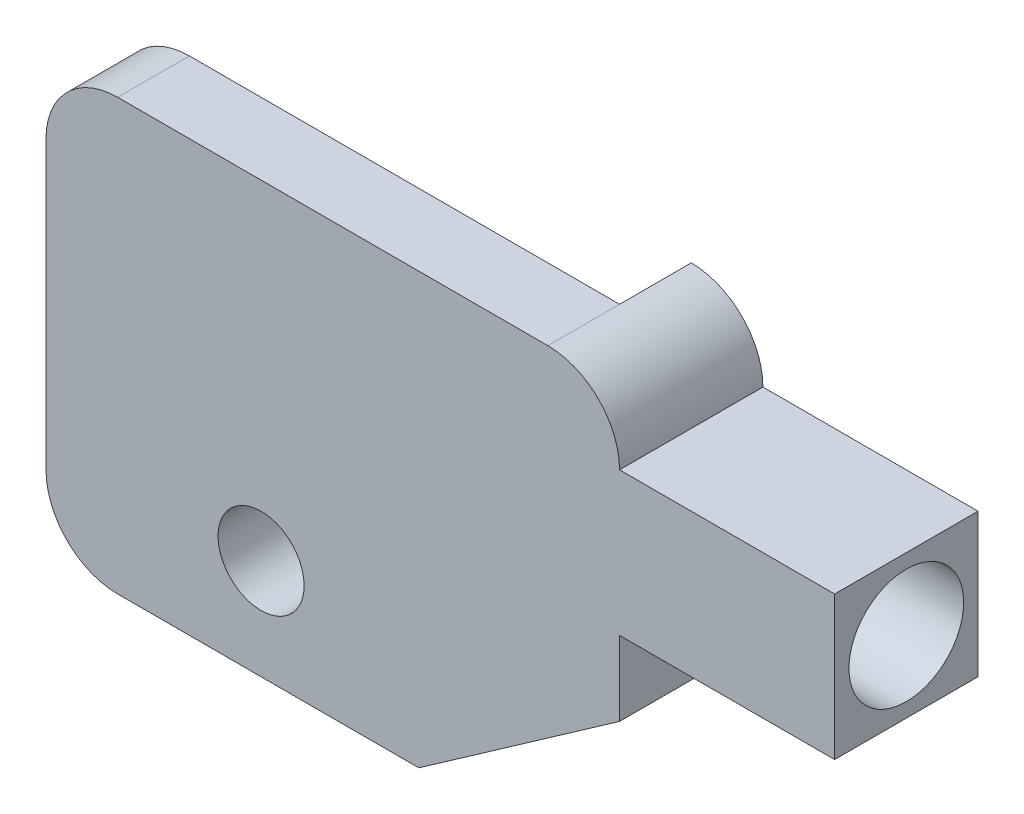
ISO-10303-21;
HEADER;
FILE_DESCRIPTION(('STEP AP214'),'2;1');
FILE_NAME('part.step','',(''),(''),'','','');
FILE_SCHEMA(('AUTOMOTIVE_DESIGN { 1 0 10303 214 1 1 1 1 }'));
ENDSEC;
DATA;
#1=APPLICATION_CONTEXT('core data for automotive mechanical design processes');
#2=APPLICATION_PROTOCOL_DEFINITION('international standard','automotive_design',2000,#1);
#3=PRODUCT_CONTEXT('',#1,'mechanical');
#4=PRODUCT('Part','Part','',(#3));
#5=PRODUCT_RELATED_PRODUCT_CATEGORY('part','',(#4));
#6=PRODUCT_DEFINITION_FORMATION('','',#4);
#7=PRODUCT_DEFINITION_CONTEXT('part definition',#1,'design');
#8=PRODUCT_DEFINITION('design','',#6,#7);
#9=PRODUCT_DEFINITION_SHAPE('','',#8);
#10=(LENGTH_UNIT() NAMED_UNIT(*) SI_UNIT(.MILLI.,.METRE.));
#11=(NAMED_UNIT(*) PLANE_ANGLE_UNIT() SI_UNIT($,.RADIAN.));
#12=(NAMED_UNIT(*) SI_UNIT($,.STERADIAN.) SOLID_ANGLE_UNIT());
#13=UNCERTAINTY_MEASURE_WITH_UNIT(LENGTH_MEASURE(1.E-05),#10,'distance_accuracy_value','');
#14=(GEOMETRIC_REPRESENTATION_CONTEXT(3) GLOBAL_UNCERTAINTY_ASSIGNED_CONTEXT((#13)) GLOBAL_UNIT_ASSIGNED_CONTEXT((#10,
#11,#12)) REPRESENTATION_CONTEXT('',''));
#15=CARTESIAN_POINT('',(0.,0.,0.));
#16=DIRECTION('',(0.,0.,1.));
#17=DIRECTION('',(1.,0.,0.));
#18=AXIS2_PLACEMENT_3D('',#15,#16,#17);
#19=CARTESIAN_POINT('',(19.05,6.34999999999999,6.35));
#20=DIRECTION('',(1.,0.,0.));
#21=DIRECTION('',(0.,0.,-1.));
#22=AXIS2_PLACEMENT_3D('',#19,#20,#21);
#23=PLANE('',#22);
#24=CARTESIAN_POINT('',(19.05,6.34999999999999,6.35));
#25=DIRECTION('',(1.,0.,0.));
#26=DIRECTION('',(0.,0.,-1.));
#27=AXIS2_PLACEMENT_3D('',#24,#25,#26);
#28=CIRCLE('',#27,5.08);
#29=CARTESIAN_POINT('',(19.05,11.43,6.35));
#30=VERTEX_POINT('',#29);
#31=CARTESIAN_POINT('',(19.05,1.26999999999998,6.35));
#32=VERTEX_POINT('',#31);
#33=EDGE_CURVE('E244',#30,#32,#28,.T.);
#34=ORIENTED_EDGE('',*,*,#33,.T.);
#35=DIRECTION('',(0.,1.,0.));
#36=VECTOR('',#35,1.);
#37=CARTESIAN_POINT('',(19.05,-19.05,6.35));
#38=LINE('',#37,#36);
#39=EDGE_CURVE('E200',#32,#30,#38,.T.);
#40=ORIENTED_EDGE('',*,*,#39,.T.);
#41=EDGE_LOOP('',(#34,#40));
#42=FACE_BOUND('',#41,.T.);
#43=ADVANCED_FACE('F35',(#42),#23,.T.);
#44=CARTESIAN_POINT('',(25.4,-19.05,12.7));
#45=DIRECTION('',(-1.,0.,0.));
#46=DIRECTION('',(0.,0.,1.));
#47=AXIS2_PLACEMENT_3D('',#44,#45,#46);
#48=PLANE('',#47);
#49=DIRECTION('',(0.,1.,0.));
#50=VECTOR('',#49,1.);
#51=CARTESIAN_POINT('',(25.4,-19.05,12.7));
#52=LINE('',#51,#50);
#53=CARTESIAN_POINT('',(25.4,-6.60030997063135,12.7));
#54=VERTEX_POINT('',#53);
#55=CARTESIAN_POINT('',(25.4,0.,12.7));
#56=VERTEX_POINT('',#55);
#57=EDGE_CURVE('E209',#54,#56,#52,.T.);
#58=ORIENTED_EDGE('',*,*,#57,.F.);
#59=DIRECTION('',(0.,0.,-1.));
#60=VECTOR('',#59,1.);
#61=CARTESIAN_POINT('',(25.4,-6.60030997063135,12.7));
#62=LINE('',#61,#60);
#63=CARTESIAN_POINT('',(25.4,-6.60030997063135,0.));
#64=VERTEX_POINT('',#63);
#65=EDGE_CURVE('E184',#54,#64,#62,.T.);
#66=ORIENTED_EDGE('',*,*,#65,.T.);
#67=DIRECTION('',(0.,1.,0.));
#68=VECTOR('',#67,1.);
#69=CARTESIAN_POINT('',(25.4,-19.05,0.));
#70=LINE('',#69,#68);
#71=CARTESIAN_POINT('',(25.4,0.,0.));
#72=VERTEX_POINT('',#71);
#73=EDGE_CURVE('E223',#64,#72,#70,.T.);
#74=ORIENTED_EDGE('',*,*,#73,.T.);
#75=DIRECTION('',(0.,0.,-1.));
#76=VECTOR('',#75,1.);
#77=CARTESIAN_POINT('',(25.4,0.,12.7));
#78=LINE('',#77,#76);
#79=EDGE_CURVE('E215',#56,#72,#78,.T.);
#80=ORIENTED_EDGE('',*,*,#79,.F.);
#81=EDGE_LOOP('',(#58,#66,#74,#80));
#82=FACE_BOUND('',#81,.T.);
#83=ADVANCED_FACE('F213',(#82),#48,.F.);
#84=CARTESIAN_POINT('',(-25.4,-19.05,12.7));
#85=DIRECTION('',(1.,0.,0.));
#86=DIRECTION('',(0.,0.,-1.));
#87=AXIS2_PLACEMENT_3D('',#84,#85,#86);
#88=PLANE('',#87);
#89=DIRECTION('',(0.,0.,-1.));
#90=VECTOR('',#89,1.);
#91=CARTESIAN_POINT('',(-25.4,12.7,12.7));
#92=LINE('',#91,#90);
#93=CARTESIAN_POINT('',(-25.4,12.7,12.7));
#94=VERTEX_POINT('',#93);
#95=CARTESIAN_POINT('',(-25.4,12.7,6.35));
#96=VERTEX_POINT('',#95);
#97=EDGE_CURVE('E161',#94,#96,#92,.T.);
#98=ORIENTED_EDGE('',*,*,#97,.T.);
#99=DIRECTION('',(0.,1.,0.));
#100=VECTOR('',#99,1.);
#101=CARTESIAN_POINT('',(-25.4,-19.05,6.35));
#102=LINE('',#101,#100);
#103=CARTESIAN_POINT('',(-25.4,-12.7,6.35));
#104=VERTEX_POINT('',#103);
#105=EDGE_CURVE('E155',#104,#96,#102,.T.);
#106=ORIENTED_EDGE('',*,*,#105,.F.);
#107=DIRECTION('',(0.,0.,-1.));
#108=VECTOR('',#107,1.);
#109=CARTESIAN_POINT('',(-25.4,-12.7,12.7));
#110=LINE('',#109,#108);
#111=CARTESIAN_POINT('',(-25.4,-12.7,12.7));
#112=VERTEX_POINT('',#111);
#113=EDGE_CURVE('E165',#104,#112,#110,.F.);
#114=ORIENTED_EDGE('',*,*,#113,.T.);
#115=DIRECTION('',(0.,-1.,0.));
#116=VECTOR('',#115,1.);
#117=CARTESIAN_POINT('',(-25.4,-19.05,12.7));
#118=LINE('',#117,#116);
#119=EDGE_CURVE('E220',#94,#112,#118,.T.);
#120=ORIENTED_EDGE('',*,*,#119,.F.);
#121=EDGE_LOOP('',(#98,#106,#114,#120));
#122=FACE_BOUND('',#121,.T.);
#123=ADVANCED_FACE('F275',(#122),#88,.F.);
#124=CARTESIAN_POINT('',(25.4,-19.05,12.7));
#125=DIRECTION('',(0.,1.,0.));
#126=DIRECTION('',(-1.,0.,0.));
#127=AXIS2_PLACEMENT_3D('',#124,#125,#126);
#128=PLANE('',#127);
#129=DIRECTION('',(-1.,0.,0.));
#130=VECTOR('',#129,1.);
#131=CARTESIAN_POINT('',(19.05,-19.05,6.35));
#132=LINE('',#131,#130);
#133=CARTESIAN_POINT('',(7.61999999999991,-19.05,6.35));
#134=VERTEX_POINT('',#133);
#135=CARTESIAN_POINT('',(-19.05,-19.05,6.35));
#136=VERTEX_POINT('',#135);
#137=EDGE_CURVE('E145',#134,#136,#132,.T.);
#138=ORIENTED_EDGE('',*,*,#137,.F.);
#139=DIRECTION('',(0.,0.,1.));
#140=VECTOR('',#139,1.);
#141=CARTESIAN_POINT('',(7.61999999999991,-19.05,12.7));
#142=LINE('',#141,#140);
#143=CARTESIAN_POINT('',(7.6199999999999,-19.05,12.7));
#144=VERTEX_POINT('',#143);
#145=EDGE_CURVE('E43',#134,#144,#142,.T.);
#146=ORIENTED_EDGE('',*,*,#145,.T.);
#147=DIRECTION('',(1.,0.,0.));
#148=VECTOR('',#147,1.);
#149=CARTESIAN_POINT('',(25.4,-19.05,12.7));
#150=LINE('',#149,#148);
#151=CARTESIAN_POINT('',(-19.05,-19.05,12.7));
#152=VERTEX_POINT('',#151);
#153=EDGE_CURVE('E211',#152,#144,#150,.T.);
#154=ORIENTED_EDGE('',*,*,#153,.F.);
#155=DIRECTION('',(0.,0.,-1.));
#156=VECTOR('',#155,1.);
#157=CARTESIAN_POINT('',(-19.05,-19.05,12.7));
#158=LINE('',#157,#156);
#159=EDGE_CURVE('E162',#152,#136,#158,.T.);
#160=ORIENTED_EDGE('',*,*,#159,.T.);
#161=EDGE_LOOP('',(#138,#146,#154,#160));
#162=FACE_BOUND('',#161,.T.);
#163=ADVANCED_FACE('F280',(#162),#128,.F.);
#164=CARTESIAN_POINT('',(25.4,19.05,12.7));
#165=DIRECTION('',(0.,-1.,0.));
#166=DIRECTION('',(1.,0.,0.));
#167=AXIS2_PLACEMENT_3D('',#164,#165,#166);
#168=PLANE('',#167);
#169=DIRECTION('',(0.,0.,-1.));
#170=VECTOR('',#169,1.);
#171=CARTESIAN_POINT('',(19.05,19.05,12.7));
#172=LINE('',#171,#170);
#173=CARTESIAN_POINT('',(19.05,19.05,12.7));
#174=VERTEX_POINT('',#173);
#175=CARTESIAN_POINT('',(19.05,19.05,6.35));
#176=VERTEX_POINT('',#175);
#177=EDGE_CURVE('E179',#174,#176,#172,.T.);
#178=ORIENTED_EDGE('',*,*,#177,.T.);
#179=DIRECTION('',(-1.,0.,0.));
#180=VECTOR('',#179,1.);
#181=CARTESIAN_POINT('',(19.05,19.05,6.35));
#182=LINE('',#181,#180);
#183=CARTESIAN_POINT('',(-19.05,19.05,6.35));
#184=VERTEX_POINT('',#183);
#185=EDGE_CURVE('E189',#176,#184,#182,.T.);
#186=ORIENTED_EDGE('',*,*,#185,.T.);
#187=DIRECTION('',(0.,0.,-1.));
#188=VECTOR('',#187,1.);
#189=CARTESIAN_POINT('',(-19.05,19.05,12.7));
#190=LINE('',#189,#188);
#191=CARTESIAN_POINT('',(-19.05,19.05,12.7));
#192=VERTEX_POINT('',#191);
#193=EDGE_CURVE('E181',#184,#192,#190,.F.);
#194=ORIENTED_EDGE('',*,*,#193,.T.);
#195=DIRECTION('',(-1.,0.,0.));
#196=VECTOR('',#195,1.);
#197=CARTESIAN_POINT('',(25.4,19.05,12.7));
#198=LINE('',#197,#196);
#199=EDGE_CURVE('E168',#174,#192,#198,.T.);
#200=ORIENTED_EDGE('',*,*,#199,.F.);
#201=EDGE_LOOP('',(#178,#186,#194,#200));
#202=FACE_BOUND('',#201,.T.);
#203=ADVANCED_FACE('F282',(#202),#168,.F.);
#204=CARTESIAN_POINT('',(0.,0.,12.7));
#205=DIRECTION('',(0.,0.,1.));
#206=DIRECTION('',(1.,0.,0.));
#207=AXIS2_PLACEMENT_3D('',#204,#205,#206);
#208=PLANE('',#207);
#209=CARTESIAN_POINT('',(-6.35,-10.16,12.7));
#210=DIRECTION('',(0.,0.,1.));
#211=DIRECTION('',(1.,0.,0.));
#212=AXIS2_PLACEMENT_3D('',#209,#210,#211);
#213=CIRCLE('',#212,3.81);
#214=CARTESIAN_POINT('',(-2.54,-10.16,12.7));
#215=VERTEX_POINT('',#214);
#216=EDGE_CURVE('E224',#215,#215,#213,.T.);
#217=ORIENTED_EDGE('',*,*,#216,.F.);
#218=EDGE_LOOP('',(#217));
#219=FACE_BOUND('',#218,.T.);
#220=ORIENTED_EDGE('',*,*,#153,.T.);
#221=DIRECTION('',(-0.819152044288993,-0.573576436351045,0.));
#222=VECTOR('',#221,1.);
#223=CARTESIAN_POINT('',(11.4574754669149,-16.3629707503713,12.7));
#224=LINE('',#223,#222);
#225=EDGE_CURVE('E11',#144,#54,#224,.F.);
#226=ORIENTED_EDGE('',*,*,#225,.T.);
#227=ORIENTED_EDGE('',*,*,#57,.T.);
#228=DIRECTION('',(-1.,0.,0.));
#229=VECTOR('',#228,1.);
#230=CARTESIAN_POINT('',(44.45,0.,12.7));
#231=LINE('',#230,#229);
#232=CARTESIAN_POINT('',(44.45,0.,12.7));
#233=VERTEX_POINT('',#232);
#234=EDGE_CURVE('E227',#233,#56,#231,.T.);
#235=ORIENTED_EDGE('',*,*,#234,.F.);
#236=DIRECTION('',(0.,-1.,0.));
#237=VECTOR('',#236,1.);
#238=CARTESIAN_POINT('',(44.45,0.,12.7));
#239=LINE('',#238,#237);
#240=CARTESIAN_POINT('',(44.45,12.7,12.7));
#241=VERTEX_POINT('',#240);
#242=EDGE_CURVE('E243',#241,#233,#239,.T.);
#243=ORIENTED_EDGE('',*,*,#242,.F.);
#244=DIRECTION('',(-1.,0.,0.));
#245=VECTOR('',#244,1.);
#246=CARTESIAN_POINT('',(44.45,12.7,12.7));
#247=LINE('',#246,#245);
#248=CARTESIAN_POINT('',(25.4,12.7,12.7));
#249=VERTEX_POINT('',#248);
#250=EDGE_CURVE('E238',#241,#249,#247,.T.);
#251=ORIENTED_EDGE('',*,*,#250,.T.);
#252=CARTESIAN_POINT('',(19.05,12.7,12.7));
#253=DIRECTION('',(0.,0.,1.));
#254=DIRECTION('',(1.,0.,0.));
#255=AXIS2_PLACEMENT_3D('',#252,#253,#254);
#256=CIRCLE('',#255,6.35);
#257=EDGE_CURVE('E173',#249,#174,#256,.T.);
#258=ORIENTED_EDGE('',*,*,#257,.T.);
#259=ORIENTED_EDGE('',*,*,#199,.T.);
#260=CARTESIAN_POINT('',(-19.05,12.7,12.7));
#261=DIRECTION('',(0.,0.,1.));
#262=DIRECTION('',(1.,0.,0.));
#263=AXIS2_PLACEMENT_3D('',#260,#261,#262);
#264=CIRCLE('',#263,6.35);
#265=EDGE_CURVE('E175',#192,#94,#264,.T.);
#266=ORIENTED_EDGE('',*,*,#265,.T.);
#267=ORIENTED_EDGE('',*,*,#119,.T.);
#268=CARTESIAN_POINT('',(-19.05,-12.7,12.7));
#269=DIRECTION('',(0.,0.,1.));
#270=DIRECTION('',(1.,0.,0.));
#271=AXIS2_PLACEMENT_3D('',#268,#269,#270);
#272=CIRCLE('',#271,6.35);
#273=EDGE_CURVE('E177',#112,#152,#272,.T.);
#274=ORIENTED_EDGE('',*,*,#273,.T.);
#275=EDGE_LOOP('',(#220,#226,#227,#235,#243,#251,#258,#259,#266,#267,#274));
#276=FACE_BOUND('',#275,.T.);
#277=ADVANCED_FACE('F207',(#219,#276),#208,.T.);
#278=CARTESIAN_POINT('',(0.,0.,0.));
#279=DIRECTION('',(0.,0.,1.));
#280=DIRECTION('',(1.,0.,0.));
#281=AXIS2_PLACEMENT_3D('',#278,#279,#280);
#282=PLANE('',#281);
#283=ORIENTED_EDGE('',*,*,#73,.F.);
#284=DIRECTION('',(0.819152044288993,0.573576436351045,0.));
#285=VECTOR('',#284,1.);
#286=CARTESIAN_POINT('',(25.4,-6.60030997063135,0.));
#287=LINE('',#286,#285);
#288=CARTESIAN_POINT('',(19.05,-11.046627838263,0.));
#289=VERTEX_POINT('',#288);
#290=EDGE_CURVE('E154',#64,#289,#287,.F.);
#291=ORIENTED_EDGE('',*,*,#290,.T.);
#292=DIRECTION('',(0.,-1.,0.));
#293=VECTOR('',#292,1.);
#294=CARTESIAN_POINT('',(19.05,-19.05,0.));
#295=LINE('',#294,#293);
#296=CARTESIAN_POINT('',(19.05,19.05,0.));
#297=VERTEX_POINT('',#296);
#298=EDGE_CURVE('E137',#297,#289,#295,.T.);
#299=ORIENTED_EDGE('',*,*,#298,.F.);
#300=CARTESIAN_POINT('',(19.05,12.7,0.));
#301=DIRECTION('',(0.,0.,1.));
#302=DIRECTION('',(1.,0.,0.));
#303=AXIS2_PLACEMENT_3D('',#300,#301,#302);
#304=CIRCLE('',#303,6.35);
#305=CARTESIAN_POINT('',(25.4,12.7,0.));
#306=VERTEX_POINT('',#305);
#307=EDGE_CURVE('E152',#297,#306,#304,.F.);
#308=ORIENTED_EDGE('',*,*,#307,.T.);
#309=DIRECTION('',(-1.,0.,0.));
#310=VECTOR('',#309,1.);
#311=CARTESIAN_POINT('',(44.45,12.7,0.));
#312=LINE('',#311,#310);
#313=CARTESIAN_POINT('',(44.45,12.7,0.));
#314=VERTEX_POINT('',#313);
#315=EDGE_CURVE('E236',#314,#306,#312,.T.);
#316=ORIENTED_EDGE('',*,*,#315,.F.);
#317=DIRECTION('',(0.,1.,0.));
#318=VECTOR('',#317,1.);
#319=CARTESIAN_POINT('',(44.45,0.,0.));
#320=LINE('',#319,#318);
#321=CARTESIAN_POINT('',(44.45,0.,0.));
#322=VERTEX_POINT('',#321);
#323=EDGE_CURVE('E246',#322,#314,#320,.T.);
#324=ORIENTED_EDGE('',*,*,#323,.F.);
#325=DIRECTION('',(-1.,0.,0.));
#326=VECTOR('',#325,1.);
#327=CARTESIAN_POINT('',(44.45,0.,0.));
#328=LINE('',#327,#326);
#329=EDGE_CURVE('E231',#322,#72,#328,.T.);
#330=ORIENTED_EDGE('',*,*,#329,.T.);
#331=EDGE_LOOP('',(#283,#291,#299,#308,#316,#324,#330));
#332=FACE_BOUND('',#331,.T.);
#333=ADVANCED_FACE('F150',(#332),#282,.F.);
#334=CARTESIAN_POINT('',(-19.05,-12.7,12.7));
#335=DIRECTION('',(0.,0.,-1.));
#336=DIRECTION('',(-1.,0.,0.));
#337=AXIS2_PLACEMENT_3D('',#334,#335,#336);
#338=CYLINDRICAL_SURFACE('',#337,6.35);
#339=CARTESIAN_POINT('',(-19.05,-12.7,6.35));
#340=DIRECTION('',(0.,0.,1.));
#341=DIRECTION('',(1.,0.,0.));
#342=AXIS2_PLACEMENT_3D('',#339,#340,#341);
#343=CIRCLE('',#342,6.35);
#344=EDGE_CURVE('E258',#136,#104,#343,.F.);
#345=ORIENTED_EDGE('',*,*,#344,.F.);
#346=ORIENTED_EDGE('',*,*,#159,.F.);
#347=ORIENTED_EDGE('',*,*,#273,.F.);
#348=ORIENTED_EDGE('',*,*,#113,.F.);
#349=EDGE_LOOP('',(#345,#346,#347,#348));
#350=FACE_BOUND('',#349,.T.);
#351=ADVANCED_FACE('F279',(#350),#338,.T.);
#352=CARTESIAN_POINT('',(-19.05,12.7,12.7));
#353=DIRECTION('',(0.,0.,-1.));
#354=DIRECTION('',(-1.,0.,0.));
#355=AXIS2_PLACEMENT_3D('',#352,#353,#354);
#356=CYLINDRICAL_SURFACE('',#355,6.35);
#357=CARTESIAN_POINT('',(-19.05,12.7,6.35));
#358=DIRECTION('',(0.,0.,1.));
#359=DIRECTION('',(1.,0.,0.));
#360=AXIS2_PLACEMENT_3D('',#357,#358,#359);
#361=CIRCLE('',#360,6.35);
#362=EDGE_CURVE('E188',#96,#184,#361,.F.);
#363=ORIENTED_EDGE('',*,*,#362,.F.);
#364=ORIENTED_EDGE('',*,*,#97,.F.);
#365=ORIENTED_EDGE('',*,*,#265,.F.);
#366=ORIENTED_EDGE('',*,*,#193,.F.);
#367=EDGE_LOOP('',(#363,#364,#365,#366));
#368=FACE_BOUND('',#367,.T.);
#369=ADVANCED_FACE('F272',(#368),#356,.T.);
#370=CARTESIAN_POINT('',(19.05,12.7,12.7));
#371=DIRECTION('',(0.,0.,-1.));
#372=DIRECTION('',(-1.,0.,0.));
#373=AXIS2_PLACEMENT_3D('',#370,#371,#372);
#374=CYLINDRICAL_SURFACE('',#373,6.35);
#375=ORIENTED_EDGE('',*,*,#257,.F.);
#376=DIRECTION('',(0.,0.,-1.));
#377=VECTOR('',#376,1.);
#378=CARTESIAN_POINT('',(25.4,12.7,12.7));
#379=LINE('',#378,#377);
#380=EDGE_CURVE('E159',#306,#249,#379,.F.);
#381=ORIENTED_EDGE('',*,*,#380,.F.);
#382=ORIENTED_EDGE('',*,*,#307,.F.);
#383=DIRECTION('',(0.,0.,-1.));
#384=VECTOR('',#383,1.);
#385=CARTESIAN_POINT('',(19.05,19.05,0.));
#386=LINE('',#385,#384);
#387=EDGE_CURVE('E134',#176,#297,#386,.T.);
#388=ORIENTED_EDGE('',*,*,#387,.F.);
#389=ORIENTED_EDGE('',*,*,#177,.F.);
#390=EDGE_LOOP('',(#375,#381,#382,#388,#389));
#391=FACE_BOUND('',#390,.T.);
#392=ADVANCED_FACE('F157',(#391),#374,.T.);
#393=CARTESIAN_POINT('',(-6.35,-10.16,0.));
#394=DIRECTION('',(0.,0.,1.));
#395=DIRECTION('',(1.,0.,0.));
#396=AXIS2_PLACEMENT_3D('',#393,#394,#395);
#397=CYLINDRICAL_SURFACE('',#396,3.81);
#398=CARTESIAN_POINT('',(-6.35,-10.16,6.35));
#399=DIRECTION('',(0.,0.,1.));
#400=DIRECTION('',(1.,0.,0.));
#401=AXIS2_PLACEMENT_3D('',#398,#399,#400);
#402=CIRCLE('',#401,3.81);
#403=CARTESIAN_POINT('',(-2.54,-10.16,6.35));
#404=VERTEX_POINT('',#403);
#405=EDGE_CURVE('E185',#404,#404,#402,.F.);
#406=ORIENTED_EDGE('',*,*,#405,.T.);
#407=EDGE_LOOP('',(#406));
#408=FACE_BOUND('',#407,.T.);
#409=ORIENTED_EDGE('',*,*,#216,.T.);
#410=EDGE_LOOP('',(#409));
#411=FACE_BOUND('',#410,.T.);
#412=ADVANCED_FACE('F316',(#408,#411),#397,.F.);
#413=CARTESIAN_POINT('',(44.45,0.,12.7));
#414=DIRECTION('',(0.,1.,0.));
#415=DIRECTION('',(0.,0.,1.));
#416=AXIS2_PLACEMENT_3D('',#413,#414,#415);
#417=PLANE('',#416);
#418=ORIENTED_EDGE('',*,*,#79,.T.);
#419=ORIENTED_EDGE('',*,*,#329,.F.);
#420=DIRECTION('',(0.,0.,-1.));
#421=VECTOR('',#420,1.);
#422=CARTESIAN_POINT('',(44.45,0.,12.7));
#423=LINE('',#422,#421);
#424=EDGE_CURVE('E248',#233,#322,#423,.T.);
#425=ORIENTED_EDGE('',*,*,#424,.F.);
#426=ORIENTED_EDGE('',*,*,#234,.T.);
#427=EDGE_LOOP('',(#418,#419,#425,#426));
#428=FACE_BOUND('',#427,.T.);
#429=ADVANCED_FACE('F312',(#428),#417,.F.);
#430=CARTESIAN_POINT('',(44.45,12.7,12.7));
#431=DIRECTION('',(0.,-1.,0.));
#432=DIRECTION('',(0.,0.,-1.));
#433=AXIS2_PLACEMENT_3D('',#430,#431,#432);
#434=PLANE('',#433);
#435=ORIENTED_EDGE('',*,*,#380,.T.);
#436=ORIENTED_EDGE('',*,*,#250,.F.);
#437=DIRECTION('',(0.,0.,1.));
#438=VECTOR('',#437,1.);
#439=CARTESIAN_POINT('',(44.45,12.7,12.7));
#440=LINE('',#439,#438);
#441=EDGE_CURVE('E241',#314,#241,#440,.T.);
#442=ORIENTED_EDGE('',*,*,#441,.F.);
#443=ORIENTED_EDGE('',*,*,#315,.T.);
#444=EDGE_LOOP('',(#435,#436,#442,#443));
#445=FACE_BOUND('',#444,.T.);
#446=ADVANCED_FACE('F308',(#445),#434,.F.);
#447=CARTESIAN_POINT('',(44.45,0.,0.));
#448=DIRECTION('',(-1.,0.,0.));
#449=DIRECTION('',(0.,0.,1.));
#450=AXIS2_PLACEMENT_3D('',#447,#448,#449);
#451=PLANE('',#450);
#452=CARTESIAN_POINT('',(44.45,6.34999999999999,6.35));
#453=DIRECTION('',(1.,0.,0.));
#454=DIRECTION('',(0.,0.,-1.));
#455=AXIS2_PLACEMENT_3D('',#452,#453,#454);
#456=CIRCLE('',#455,5.08);
#457=CARTESIAN_POINT('',(44.45,6.34999999999999,1.27));
#458=VERTEX_POINT('',#457);
#459=EDGE_CURVE('E252',#458,#458,#456,.T.);
#460=ORIENTED_EDGE('',*,*,#459,.F.);
#461=EDGE_LOOP('',(#460));
#462=FACE_BOUND('',#461,.T.);
#463=ORIENTED_EDGE('',*,*,#242,.T.);
#464=ORIENTED_EDGE('',*,*,#424,.T.);
#465=ORIENTED_EDGE('',*,*,#323,.T.);
#466=ORIENTED_EDGE('',*,*,#441,.T.);
#467=EDGE_LOOP('',(#463,#464,#465,#466));
#468=FACE_BOUND('',#467,.T.);
#469=ADVANCED_FACE('F304',(#462,#468),#451,.F.);
#470=CARTESIAN_POINT('',(19.05,6.34999999999999,6.35));
#471=DIRECTION('',(1.,0.,0.));
#472=DIRECTION('',(0.,0.,-1.));
#473=AXIS2_PLACEMENT_3D('',#470,#471,#472);
#474=CYLINDRICAL_SURFACE('',#473,5.08);
#475=ORIENTED_EDGE('',*,*,#33,.F.);
#476=EDGE_CURVE('E255',#32,#30,#28,.T.);
#477=ORIENTED_EDGE('',*,*,#476,.F.);
#478=EDGE_LOOP('',(#475,#477));
#479=FACE_BOUND('',#478,.T.);
#480=ORIENTED_EDGE('',*,*,#459,.T.);
#481=EDGE_LOOP('',(#480));
#482=FACE_BOUND('',#481,.T.);
#483=ADVANCED_FACE('F301',(#479,#482),#474,.F.);
#484=CARTESIAN_POINT('',(19.05,-19.05,6.35));
#485=DIRECTION('',(0.,0.,1.));
#486=DIRECTION('',(1.,0.,0.));
#487=AXIS2_PLACEMENT_3D('',#484,#485,#486);
#488=PLANE('',#487);
#489=CARTESIAN_POINT('',(19.05,-11.046627838263,6.35));
#490=VERTEX_POINT('',#489);
#491=EDGE_CURVE('E146',#490,#32,#38,.T.);
#492=ORIENTED_EDGE('',*,*,#491,.F.);
#493=DIRECTION('',(0.819152044288993,0.573576436351045,0.));
#494=VECTOR('',#493,1.);
#495=CARTESIAN_POINT('',(25.4,-6.60030997063135,6.35));
#496=LINE('',#495,#494);
#497=EDGE_CURVE('E57',#490,#134,#496,.F.);
#498=ORIENTED_EDGE('',*,*,#497,.T.);
#499=ORIENTED_EDGE('',*,*,#137,.T.);
#500=ORIENTED_EDGE('',*,*,#344,.T.);
#501=ORIENTED_EDGE('',*,*,#105,.T.);
#502=ORIENTED_EDGE('',*,*,#362,.T.);
#503=ORIENTED_EDGE('',*,*,#185,.F.);
#504=EDGE_CURVE('E140',#30,#176,#38,.T.);
#505=ORIENTED_EDGE('',*,*,#504,.F.);
#506=ORIENTED_EDGE('',*,*,#39,.F.);
#507=EDGE_LOOP('',(#492,#498,#499,#500,#501,#502,#503,#505,#506));
#508=FACE_BOUND('',#507,.T.);
#509=ORIENTED_EDGE('',*,*,#405,.F.);
#510=EDGE_LOOP('',(#509));
#511=FACE_BOUND('',#510,.T.);
#512=ADVANCED_FACE('F197',(#508,#511),#488,.F.);
#513=CARTESIAN_POINT('',(19.05,0.,0.));
#514=DIRECTION('',(1.,0.,0.));
#515=DIRECTION('',(0.,0.,-1.));
#516=AXIS2_PLACEMENT_3D('',#513,#514,#515);
#517=PLANE('',#516);
#518=ORIENTED_EDGE('',*,*,#298,.T.);
#519=DIRECTION('',(0.,0.,-1.));
#520=VECTOR('',#519,1.);
#521=CARTESIAN_POINT('',(19.05,-11.046627838263,12.7));
#522=LINE('',#521,#520);
#523=EDGE_CURVE('E193',#289,#490,#522,.F.);
#524=ORIENTED_EDGE('',*,*,#523,.T.);
#525=ORIENTED_EDGE('',*,*,#491,.T.);
#526=ORIENTED_EDGE('',*,*,#476,.T.);
#527=ORIENTED_EDGE('',*,*,#504,.T.);
#528=ORIENTED_EDGE('',*,*,#387,.T.);
#529=EDGE_LOOP('',(#518,#524,#525,#526,#527,#528));
#530=FACE_BOUND('',#529,.T.);
#531=ADVANCED_FACE('F136',(#530),#517,.F.);
#532=CARTESIAN_POINT('',(25.4,-6.60030997063135,12.7));
#533=DIRECTION('',(-0.573576436351045,0.819152044288993,0.));
#534=DIRECTION('',(0.,0.,-1.));
#535=AXIS2_PLACEMENT_3D('',#532,#533,#534);
#536=PLANE('',#535);
#537=ORIENTED_EDGE('',*,*,#225,.F.);
#538=ORIENTED_EDGE('',*,*,#145,.F.);
#539=ORIENTED_EDGE('',*,*,#497,.F.);
#540=ORIENTED_EDGE('',*,*,#523,.F.);
#541=ORIENTED_EDGE('',*,*,#290,.F.);
#542=ORIENTED_EDGE('',*,*,#65,.F.);
#543=EDGE_LOOP('',(#537,#538,#539,#540,#541,#542));
#544=FACE_BOUND('',#543,.T.);
#545=ADVANCED_FACE('F37',(#544),#536,.F.);
#546=CLOSED_SHELL('',(#43,#83,#123,#163,#203,#277,#333,#351,#369,#392,#412,#429,#446,#469,#483,
#512,#531,#545));
#547=MANIFOLD_SOLID_BREP('B2',#546);
#548=ADVANCED_BREP_SHAPE_REPRESENTATION('',(#18,#547),#14);
#549=SHAPE_DEFINITION_REPRESENTATION(#9,#548);
ENDSEC;
END-ISO-10303-21;
